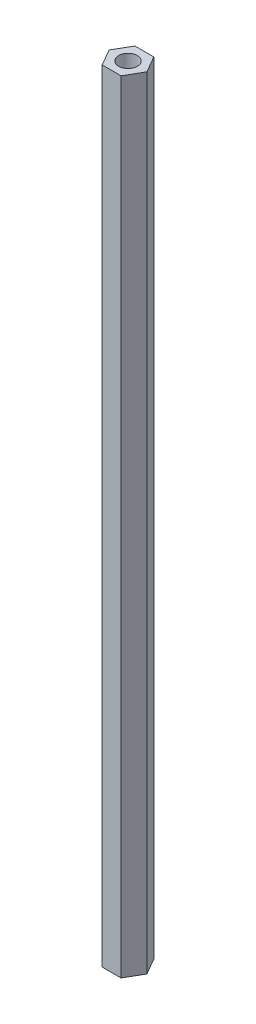
ISO-10303-21;
HEADER;
FILE_DESCRIPTION(('STEP AP214'),'2;1');
FILE_NAME('part.step','',(''),(''),'','','');
FILE_SCHEMA(('AUTOMOTIVE_DESIGN { 1 0 10303 214 1 1 1 1 }'));
ENDSEC;
DATA;
#1=APPLICATION_CONTEXT('core data for automotive mechanical design processes');
#2=APPLICATION_PROTOCOL_DEFINITION('international standard','automotive_design',2000,#1);
#3=PRODUCT_CONTEXT('',#1,'mechanical');
#4=PRODUCT('Part','Part','',(#3));
#5=PRODUCT_RELATED_PRODUCT_CATEGORY('part','',(#4));
#6=PRODUCT_DEFINITION_FORMATION('','',#4);
#7=PRODUCT_DEFINITION_CONTEXT('part definition',#1,'design');
#8=PRODUCT_DEFINITION('design','',#6,#7);
#9=PRODUCT_DEFINITION_SHAPE('','',#8);
#10=(LENGTH_UNIT() NAMED_UNIT(*) SI_UNIT(.MILLI.,.METRE.));
#11=(NAMED_UNIT(*) PLANE_ANGLE_UNIT() SI_UNIT($,.RADIAN.));
#12=(NAMED_UNIT(*) SI_UNIT($,.STERADIAN.) SOLID_ANGLE_UNIT());
#13=UNCERTAINTY_MEASURE_WITH_UNIT(LENGTH_MEASURE(1.E-05),#10,'distance_accuracy_value','');
#14=(GEOMETRIC_REPRESENTATION_CONTEXT(3) GLOBAL_UNCERTAINTY_ASSIGNED_CONTEXT((#13)) GLOBAL_UNIT_ASSIGNED_CONTEXT((#10,
#11,#12)) REPRESENTATION_CONTEXT('',''));
#15=CARTESIAN_POINT('',(0.,0.,0.));
#16=DIRECTION('',(0.,0.,1.));
#17=DIRECTION('',(1.,0.,0.));
#18=AXIS2_PLACEMENT_3D('',#15,#16,#17);
#19=CARTESIAN_POINT('',(0.,167.,0.));
#20=DIRECTION('',(0.,1.,0.));
#21=DIRECTION('',(0.,0.,1.));
#22=AXIS2_PLACEMENT_3D('',#19,#20,#21);
#23=PLANE('',#22);
#24=DIRECTION('',(0.499999999999999,0.,-0.866025403784439));
#25=VECTOR('',#24,1.);
#26=CARTESIAN_POINT('',(2.02072594216369,167.,3.5));
#27=LINE('',#26,#25);
#28=CARTESIAN_POINT('',(2.02072594216369,167.,3.5));
#29=VERTEX_POINT('',#28);
#30=CARTESIAN_POINT('',(4.04145188432738,167.,0.));
#31=VERTEX_POINT('',#30);
#32=EDGE_CURVE('E152',#29,#31,#27,.T.);
#33=ORIENTED_EDGE('',*,*,#32,.T.);
#34=DIRECTION('',(-0.5,0.,-0.866025403784438));
#35=VECTOR('',#34,1.);
#36=CARTESIAN_POINT('',(4.04145188432738,167.,0.));
#37=LINE('',#36,#35);
#38=CARTESIAN_POINT('',(2.02072594216369,167.,-3.5));
#39=VERTEX_POINT('',#38);
#40=EDGE_CURVE('E100',#31,#39,#37,.T.);
#41=ORIENTED_EDGE('',*,*,#40,.T.);
#42=DIRECTION('',(-1.,0.,0.));
#43=VECTOR('',#42,1.);
#44=CARTESIAN_POINT('',(2.02072594216369,167.,-3.5));
#45=LINE('',#44,#43);
#46=CARTESIAN_POINT('',(-2.02072594216369,167.,-3.5));
#47=VERTEX_POINT('',#46);
#48=EDGE_CURVE('E113',#39,#47,#45,.T.);
#49=ORIENTED_EDGE('',*,*,#48,.T.);
#50=DIRECTION('',(-0.5,0.,0.866025403784439));
#51=VECTOR('',#50,1.);
#52=CARTESIAN_POINT('',(-2.02072594216369,167.,-3.5));
#53=LINE('',#52,#51);
#54=CARTESIAN_POINT('',(-4.04145188432738,167.,0.));
#55=VERTEX_POINT('',#54);
#56=EDGE_CURVE('E107',#47,#55,#53,.T.);
#57=ORIENTED_EDGE('',*,*,#56,.T.);
#58=DIRECTION('',(0.5,0.,0.866025403784439));
#59=VECTOR('',#58,1.);
#60=CARTESIAN_POINT('',(-4.04145188432738,167.,0.));
#61=LINE('',#60,#59);
#62=CARTESIAN_POINT('',(-2.02072594216369,167.,3.5));
#63=VERTEX_POINT('',#62);
#64=EDGE_CURVE('E111',#55,#63,#61,.T.);
#65=ORIENTED_EDGE('',*,*,#64,.T.);
#66=DIRECTION('',(1.,0.,0.));
#67=VECTOR('',#66,1.);
#68=CARTESIAN_POINT('',(-2.02072594216369,167.,3.5));
#69=LINE('',#68,#67);
#70=EDGE_CURVE('E63',#63,#29,#69,.T.);
#71=ORIENTED_EDGE('',*,*,#70,.T.);
#72=EDGE_LOOP('',(#33,#41,#49,#57,#65,#71));
#73=FACE_BOUND('',#72,.T.);
#74=CARTESIAN_POINT('',(0.,167.,0.));
#75=DIRECTION('',(0.,1.,0.));
#76=DIRECTION('',(0.,0.,1.));
#77=AXIS2_PLACEMENT_3D('',#74,#75,#76);
#78=CIRCLE('',#77,2.);
#79=CARTESIAN_POINT('',(0.,167.,-2.));
#80=VERTEX_POINT('',#79);
#81=EDGE_CURVE('E140',#80,#80,#78,.T.);
#82=ORIENTED_EDGE('',*,*,#81,.F.);
#83=EDGE_LOOP('',(#82));
#84=FACE_BOUND('',#83,.T.);
#85=ADVANCED_FACE('F45',(#73,#84),#23,.T.);
#86=CARTESIAN_POINT('',(0.,0.,0.));
#87=DIRECTION('',(0.,1.,0.));
#88=DIRECTION('',(0.,0.,1.));
#89=AXIS2_PLACEMENT_3D('',#86,#87,#88);
#90=PLANE('',#89);
#91=DIRECTION('',(0.499999999999999,0.,-0.866025403784439));
#92=VECTOR('',#91,1.);
#93=CARTESIAN_POINT('',(2.02072594216369,0.,3.5));
#94=LINE('',#93,#92);
#95=CARTESIAN_POINT('',(2.02072594216369,0.,3.5));
#96=VERTEX_POINT('',#95);
#97=CARTESIAN_POINT('',(4.04145188432738,0.,0.));
#98=VERTEX_POINT('',#97);
#99=EDGE_CURVE('E135',#96,#98,#94,.T.);
#100=ORIENTED_EDGE('',*,*,#99,.F.);
#101=DIRECTION('',(1.,0.,0.));
#102=VECTOR('',#101,1.);
#103=CARTESIAN_POINT('',(-2.02072594216369,0.,3.5));
#104=LINE('',#103,#102);
#105=CARTESIAN_POINT('',(-2.02072594216369,0.,3.5));
#106=VERTEX_POINT('',#105);
#107=EDGE_CURVE('E92',#106,#96,#104,.T.);
#108=ORIENTED_EDGE('',*,*,#107,.F.);
#109=DIRECTION('',(0.5,0.,0.866025403784439));
#110=VECTOR('',#109,1.);
#111=CARTESIAN_POINT('',(-4.04145188432738,0.,0.));
#112=LINE('',#111,#110);
#113=CARTESIAN_POINT('',(-4.04145188432738,0.,0.));
#114=VERTEX_POINT('',#113);
#115=EDGE_CURVE('E86',#114,#106,#112,.T.);
#116=ORIENTED_EDGE('',*,*,#115,.F.);
#117=DIRECTION('',(-0.5,0.,0.866025403784439));
#118=VECTOR('',#117,1.);
#119=CARTESIAN_POINT('',(-2.02072594216369,0.,-3.5));
#120=LINE('',#119,#118);
#121=CARTESIAN_POINT('',(-2.02072594216369,0.,-3.5));
#122=VERTEX_POINT('',#121);
#123=EDGE_CURVE('E122',#122,#114,#120,.T.);
#124=ORIENTED_EDGE('',*,*,#123,.F.);
#125=DIRECTION('',(-1.,0.,0.));
#126=VECTOR('',#125,1.);
#127=CARTESIAN_POINT('',(2.02072594216369,0.,-3.5));
#128=LINE('',#127,#126);
#129=CARTESIAN_POINT('',(2.02072594216369,0.,-3.5));
#130=VERTEX_POINT('',#129);
#131=EDGE_CURVE('E143',#130,#122,#128,.T.);
#132=ORIENTED_EDGE('',*,*,#131,.F.);
#133=DIRECTION('',(-0.5,0.,-0.866025403784438));
#134=VECTOR('',#133,1.);
#135=CARTESIAN_POINT('',(4.04145188432738,0.,0.));
#136=LINE('',#135,#134);
#137=EDGE_CURVE('E139',#98,#130,#136,.T.);
#138=ORIENTED_EDGE('',*,*,#137,.F.);
#139=EDGE_LOOP('',(#100,#108,#116,#124,#132,#138));
#140=FACE_BOUND('',#139,.T.);
#141=CARTESIAN_POINT('',(0.,0.,0.));
#142=DIRECTION('',(0.,1.,0.));
#143=DIRECTION('',(0.,0.,1.));
#144=AXIS2_PLACEMENT_3D('',#141,#142,#143);
#145=CIRCLE('',#144,2.);
#146=CARTESIAN_POINT('',(0.,0.,-2.));
#147=VERTEX_POINT('',#146);
#148=EDGE_CURVE('E249',#147,#147,#145,.T.);
#149=ORIENTED_EDGE('',*,*,#148,.T.);
#150=EDGE_LOOP('',(#149));
#151=FACE_BOUND('',#150,.T.);
#152=ADVANCED_FACE('F165',(#140,#151),#90,.F.);
#153=CARTESIAN_POINT('',(2.02072594216369,167.,3.5));
#154=DIRECTION('',(-0.866025403784439,0.,-0.499999999999999));
#155=DIRECTION('',(-0.499999999999999,0.,0.866025403784439));
#156=AXIS2_PLACEMENT_3D('',#153,#154,#155);
#157=PLANE('',#156);
#158=ORIENTED_EDGE('',*,*,#99,.T.);
#159=DIRECTION('',(0.,-1.,0.));
#160=VECTOR('',#159,1.);
#161=CARTESIAN_POINT('',(4.04145188432738,167.,0.));
#162=LINE('',#161,#160);
#163=EDGE_CURVE('E11',#31,#98,#162,.T.);
#164=ORIENTED_EDGE('',*,*,#163,.F.);
#165=ORIENTED_EDGE('',*,*,#32,.F.);
#166=DIRECTION('',(0.,-1.,0.));
#167=VECTOR('',#166,1.);
#168=CARTESIAN_POINT('',(2.02072594216369,167.,3.5));
#169=LINE('',#168,#167);
#170=EDGE_CURVE('E131',#29,#96,#169,.T.);
#171=ORIENTED_EDGE('',*,*,#170,.T.);
#172=EDGE_LOOP('',(#158,#164,#165,#171));
#173=FACE_BOUND('',#172,.T.);
#174=ADVANCED_FACE('F47',(#173),#157,.F.);
#175=CARTESIAN_POINT('',(4.04145188432738,167.,0.));
#176=DIRECTION('',(-0.866025403784439,0.,0.5));
#177=DIRECTION('',(0.5,0.,0.866025403784439));
#178=AXIS2_PLACEMENT_3D('',#175,#176,#177);
#179=PLANE('',#178);
#180=ORIENTED_EDGE('',*,*,#137,.T.);
#181=DIRECTION('',(0.,-1.,0.));
#182=VECTOR('',#181,1.);
#183=CARTESIAN_POINT('',(2.02072594216369,167.,-3.5));
#184=LINE('',#183,#182);
#185=EDGE_CURVE('E55',#39,#130,#184,.T.);
#186=ORIENTED_EDGE('',*,*,#185,.F.);
#187=ORIENTED_EDGE('',*,*,#40,.F.);
#188=ORIENTED_EDGE('',*,*,#163,.T.);
#189=EDGE_LOOP('',(#180,#186,#187,#188));
#190=FACE_BOUND('',#189,.T.);
#191=ADVANCED_FACE('F190',(#190),#179,.F.);
#192=CARTESIAN_POINT('',(2.02072594216369,167.,-3.5));
#193=DIRECTION('',(0.,0.,1.));
#194=DIRECTION('',(1.,0.,0.));
#195=AXIS2_PLACEMENT_3D('',#192,#193,#194);
#196=PLANE('',#195);
#197=ORIENTED_EDGE('',*,*,#131,.T.);
#198=DIRECTION('',(0.,-1.,0.));
#199=VECTOR('',#198,1.);
#200=CARTESIAN_POINT('',(-2.02072594216369,167.,-3.5));
#201=LINE('',#200,#199);
#202=EDGE_CURVE('E124',#47,#122,#201,.T.);
#203=ORIENTED_EDGE('',*,*,#202,.F.);
#204=ORIENTED_EDGE('',*,*,#48,.F.);
#205=ORIENTED_EDGE('',*,*,#185,.T.);
#206=EDGE_LOOP('',(#197,#203,#204,#205));
#207=FACE_BOUND('',#206,.T.);
#208=ADVANCED_FACE('F162',(#207),#196,.F.);
#209=CARTESIAN_POINT('',(-2.02072594216369,167.,-3.5));
#210=DIRECTION('',(0.866025403784439,0.,0.5));
#211=DIRECTION('',(0.5,0.,-0.866025403784439));
#212=AXIS2_PLACEMENT_3D('',#209,#210,#211);
#213=PLANE('',#212);
#214=ORIENTED_EDGE('',*,*,#123,.T.);
#215=DIRECTION('',(0.,-1.,0.));
#216=VECTOR('',#215,1.);
#217=CARTESIAN_POINT('',(-4.04145188432738,167.,0.));
#218=LINE('',#217,#216);
#219=EDGE_CURVE('E119',#55,#114,#218,.T.);
#220=ORIENTED_EDGE('',*,*,#219,.F.);
#221=ORIENTED_EDGE('',*,*,#56,.F.);
#222=ORIENTED_EDGE('',*,*,#202,.T.);
#223=EDGE_LOOP('',(#214,#220,#221,#222));
#224=FACE_BOUND('',#223,.T.);
#225=ADVANCED_FACE('F120',(#224),#213,.F.);
#226=CARTESIAN_POINT('',(-4.04145188432738,167.,0.));
#227=DIRECTION('',(0.866025403784438,0.,-0.5));
#228=DIRECTION('',(-0.5,0.,-0.866025403784439));
#229=AXIS2_PLACEMENT_3D('',#226,#227,#228);
#230=PLANE('',#229);
#231=ORIENTED_EDGE('',*,*,#115,.T.);
#232=DIRECTION('',(0.,-1.,0.));
#233=VECTOR('',#232,1.);
#234=CARTESIAN_POINT('',(-2.02072594216369,167.,3.5));
#235=LINE('',#234,#233);
#236=EDGE_CURVE('E125',#63,#106,#235,.T.);
#237=ORIENTED_EDGE('',*,*,#236,.F.);
#238=ORIENTED_EDGE('',*,*,#64,.F.);
#239=ORIENTED_EDGE('',*,*,#219,.T.);
#240=EDGE_LOOP('',(#231,#237,#238,#239));
#241=FACE_BOUND('',#240,.T.);
#242=ADVANCED_FACE('F127',(#241),#230,.F.);
#243=CARTESIAN_POINT('',(-2.02072594216369,167.,3.5));
#244=DIRECTION('',(0.,0.,-1.));
#245=DIRECTION('',(-1.,0.,0.));
#246=AXIS2_PLACEMENT_3D('',#243,#244,#245);
#247=PLANE('',#246);
#248=ORIENTED_EDGE('',*,*,#107,.T.);
#249=ORIENTED_EDGE('',*,*,#170,.F.);
#250=ORIENTED_EDGE('',*,*,#70,.F.);
#251=ORIENTED_EDGE('',*,*,#236,.T.);
#252=EDGE_LOOP('',(#248,#249,#250,#251));
#253=FACE_BOUND('',#252,.T.);
#254=ADVANCED_FACE('F170',(#253),#247,.F.);
#255=CARTESIAN_POINT('',(0.,167.,0.));
#256=DIRECTION('',(0.,-1.,0.));
#257=DIRECTION('',(0.,0.,-1.));
#258=AXIS2_PLACEMENT_3D('',#255,#256,#257);
#259=CYLINDRICAL_SURFACE('',#258,2.);
#260=CARTESIAN_POINT('',(0.,167.,-2.));
#261=CARTESIAN_POINT('',(0.,165.260416666667,-2.));
#262=CARTESIAN_POINT('',(0.,163.520833333333,-2.));
#263=CARTESIAN_POINT('',(0.,160.041666666667,-2.));
#264=CARTESIAN_POINT('',(0.,158.302083333333,-2.));
#265=CARTESIAN_POINT('',(0.,154.822916666667,-2.));
#266=CARTESIAN_POINT('',(0.,153.083333333333,-2.));
#267=CARTESIAN_POINT('',(0.,149.604166666667,-2.));
#268=CARTESIAN_POINT('',(0.,147.864583333333,-2.));
#269=CARTESIAN_POINT('',(0.,144.385416666667,-2.));
#270=CARTESIAN_POINT('',(0.,142.645833333333,-2.));
#271=CARTESIAN_POINT('',(0.,139.166666666667,-2.));
#272=CARTESIAN_POINT('',(0.,137.427083333333,-2.));
#273=CARTESIAN_POINT('',(0.,133.947916666667,-2.));
#274=CARTESIAN_POINT('',(0.,132.208333333333,-2.));
#275=CARTESIAN_POINT('',(0.,128.729166666667,-2.));
#276=CARTESIAN_POINT('',(0.,126.989583333333,-2.));
#277=CARTESIAN_POINT('',(0.,123.510416666667,-2.));
#278=CARTESIAN_POINT('',(0.,121.770833333333,-2.));
#279=CARTESIAN_POINT('',(0.,118.291666666667,-2.));
#280=CARTESIAN_POINT('',(0.,116.552083333333,-2.));
#281=CARTESIAN_POINT('',(0.,113.072916666667,-2.));
#282=CARTESIAN_POINT('',(0.,111.333333333333,-2.));
#283=CARTESIAN_POINT('',(0.,107.854166666667,-2.));
#284=CARTESIAN_POINT('',(0.,106.114583333333,-2.));
#285=CARTESIAN_POINT('',(0.,102.635416666667,-2.));
#286=CARTESIAN_POINT('',(0.,100.895833333333,-2.));
#287=CARTESIAN_POINT('',(0.,97.4166666666667,-2.));
#288=CARTESIAN_POINT('',(0.,95.6770833333333,-2.));
#289=CARTESIAN_POINT('',(0.,92.1979166666667,-2.));
#290=CARTESIAN_POINT('',(0.,90.4583333333333,-2.));
#291=CARTESIAN_POINT('',(0.,86.9791666666666,-2.));
#292=CARTESIAN_POINT('',(0.,85.2395833333333,-2.));
#293=CARTESIAN_POINT('',(0.,81.7604166666667,-2.));
#294=CARTESIAN_POINT('',(0.,80.0208333333333,-2.));
#295=CARTESIAN_POINT('',(0.,76.5416666666667,-2.));
#296=CARTESIAN_POINT('',(0.,74.8020833333333,-2.));
#297=CARTESIAN_POINT('',(0.,71.3229166666667,-2.));
#298=CARTESIAN_POINT('',(0.,69.5833333333333,-2.));
#299=CARTESIAN_POINT('',(0.,66.1041666666666,-2.));
#300=CARTESIAN_POINT('',(0.,64.3645833333333,-2.));
#301=CARTESIAN_POINT('',(0.,60.8854166666667,-2.));
#302=CARTESIAN_POINT('',(0.,59.1458333333333,-2.));
#303=CARTESIAN_POINT('',(0.,55.6666666666667,-2.));
#304=CARTESIAN_POINT('',(0.,53.9270833333333,-2.));
#305=CARTESIAN_POINT('',(0.,50.4479166666667,-2.));
#306=CARTESIAN_POINT('',(0.,48.7083333333333,-2.));
#307=CARTESIAN_POINT('',(0.,45.2291666666667,-2.));
#308=CARTESIAN_POINT('',(0.,43.4895833333333,-2.));
#309=CARTESIAN_POINT('',(0.,40.0104166666667,-2.));
#310=CARTESIAN_POINT('',(0.,38.2708333333333,-2.));
#311=CARTESIAN_POINT('',(0.,34.7916666666667,-2.));
#312=CARTESIAN_POINT('',(0.,33.0520833333333,-2.));
#313=CARTESIAN_POINT('',(0.,29.5729166666667,-2.));
#314=CARTESIAN_POINT('',(0.,27.8333333333333,-2.));
#315=CARTESIAN_POINT('',(0.,24.3541666666667,-2.));
#316=CARTESIAN_POINT('',(0.,22.6145833333333,-2.));
#317=CARTESIAN_POINT('',(0.,19.1354166666667,-2.));
#318=CARTESIAN_POINT('',(0.,17.3958333333333,-2.));
#319=CARTESIAN_POINT('',(0.,13.9166666666667,-2.));
#320=CARTESIAN_POINT('',(0.,12.1770833333333,-2.));
#321=CARTESIAN_POINT('',(0.,8.69791666666666,-2.));
#322=CARTESIAN_POINT('',(0.,6.95833333333333,-2.));
#323=CARTESIAN_POINT('',(0.,3.47916666666666,-2.));
#324=CARTESIAN_POINT('',(0.,1.73958333333333,-2.));
#325=CARTESIAN_POINT('',(0.,0.,-2.));
#326=B_SPLINE_CURVE_WITH_KNOTS('',3,(#260,#261,#262,#263,#264,#265,#266,#267,#268,#269,#270,
#271,#272,#273,#274,#275,#276,#277,#278,#279,#280,#281,#282,#283,#284,#285,#286,#287,#288,#289,
#290,#291,#292,#293,#294,#295,#296,#297,#298,#299,#300,#301,#302,#303,#304,#305,#306,#307,#308,
#309,#310,#311,#312,#313,#314,#315,#316,#317,#318,#319,#320,#321,#322,#323,#324,#325),
.UNSPECIFIED.,.F.,.F.,(4,2,2,2,2,2,2,2,2,2,2,2,2,2,2,2,2,2,2,2,2,2,2,2,2,2,2,2,2,2,2,2,4),(0.,
5.21875000000002,10.4375,15.65625,20.875,26.09375,31.3125,36.53125,41.75,46.96875,52.1875,
57.40625,62.625,67.84375,73.0625,78.28125,83.5,88.71875,93.9375,99.15625,104.375,109.59375,
114.8125,120.03125,125.25,130.46875,135.6875,140.90625,146.125,151.34375,156.5625,161.78125,
167.),.UNSPECIFIED.);
#327=EDGE_CURVE('BSEAM172',#80,#147,#326,.T.);
#328=ORIENTED_EDGE('',*,*,#81,.T.);
#329=ORIENTED_EDGE('',*,*,#148,.F.);
#330=ORIENTED_EDGE('',*,*,#327,.T.);
#331=ORIENTED_EDGE('',*,*,#327,.F.);
#332=EDGE_LOOP('',(#328,#330,#329,#331));
#333=FACE_BOUND('',#332,.T.);
#334=ADVANCED_FACE('F172',(#333),#259,.F.);
#335=CLOSED_SHELL('',(#85,#152,#174,#191,#208,#225,#242,#254,#334));
#336=MANIFOLD_SOLID_BREP('B2',#335);
#337=ADVANCED_BREP_SHAPE_REPRESENTATION('',(#18,#336),#14);
#338=SHAPE_DEFINITION_REPRESENTATION(#9,#337);
ENDSEC;
END-ISO-10303-21;
